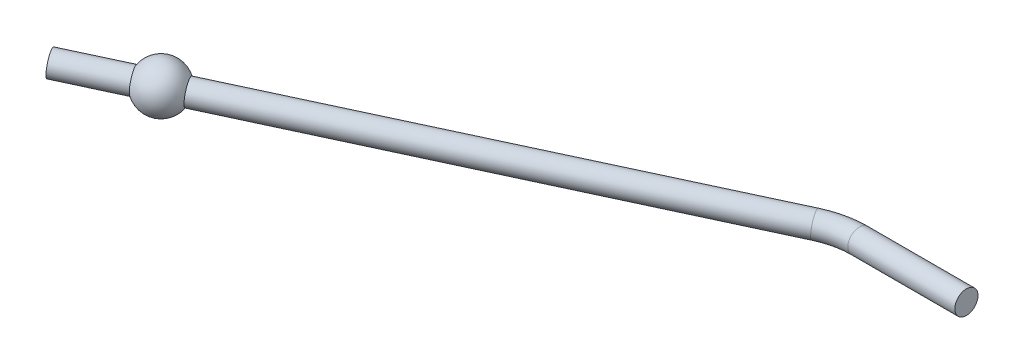
ISO-10303-21;
HEADER;
FILE_DESCRIPTION(('STEP AP214'),'2;1');
FILE_NAME('part.step','',(''),(''),'','','');
FILE_SCHEMA(('AUTOMOTIVE_DESIGN { 1 0 10303 214 1 1 1 1 }'));
ENDSEC;
DATA;
#1=APPLICATION_CONTEXT('core data for automotive mechanical design processes');
#2=APPLICATION_PROTOCOL_DEFINITION('international standard','automotive_design',2000,#1);
#3=PRODUCT_CONTEXT('',#1,'mechanical');
#4=PRODUCT('Part','Part','',(#3));
#5=PRODUCT_RELATED_PRODUCT_CATEGORY('part','',(#4));
#6=PRODUCT_DEFINITION_FORMATION('','',#4);
#7=PRODUCT_DEFINITION_CONTEXT('part definition',#1,'design');
#8=PRODUCT_DEFINITION('design','',#6,#7);
#9=PRODUCT_DEFINITION_SHAPE('','',#8);
#10=(LENGTH_UNIT() NAMED_UNIT(*) SI_UNIT(.MILLI.,.METRE.));
#11=(NAMED_UNIT(*) PLANE_ANGLE_UNIT() SI_UNIT($,.RADIAN.));
#12=(NAMED_UNIT(*) SI_UNIT($,.STERADIAN.) SOLID_ANGLE_UNIT());
#13=UNCERTAINTY_MEASURE_WITH_UNIT(LENGTH_MEASURE(1.E-05),#10,'distance_accuracy_value','');
#14=(GEOMETRIC_REPRESENTATION_CONTEXT(3) GLOBAL_UNCERTAINTY_ASSIGNED_CONTEXT((#13)) GLOBAL_UNIT_ASSIGNED_CONTEXT((#10,
#11,#12)) REPRESENTATION_CONTEXT('',''));
#15=CARTESIAN_POINT('',(0.,0.,0.));
#16=DIRECTION('',(0.,0.,1.));
#17=DIRECTION('',(1.,0.,0.));
#18=AXIS2_PLACEMENT_3D('',#15,#16,#17);
#19=CARTESIAN_POINT('',(-68.6428100890678,4.22365233231175,31.6927115761108));
#20=DIRECTION('',(0.86398913526091,-0.0665142099576653,-0.499097820096233));
#21=DIRECTION('',(-0.500205536319584,0.,-0.865906704810188));
#22=AXIS2_PLACEMENT_3D('',#19,#20,#21);
#23=CYLINDRICAL_SURFACE('',#22,1.27);
#24=CARTESIAN_POINT('',(-15.5578955589094,0.136909795234124,1.02732003273683));
#25=DIRECTION('',(0.863989135260911,-0.0665142099576653,-0.499097820096233));
#26=DIRECTION('',(-0.500205536319583,0.,-0.865906704810188));
#27=AXIS2_PLACEMENT_3D('',#24,#25,#26);
#28=CIRCLE('',#27,1.27);
#29=CARTESIAN_POINT('',(-16.1973538315342,-0.00804011473568033,-0.0603300218172294));
#30=VERTEX_POINT('',#29);
#31=EDGE_CURVE('E62',#30,#30,#28,.T.);
#32=ORIENTED_EDGE('',*,*,#31,.F.);
#33=EDGE_LOOP('',(#32));
#34=FACE_BOUND('',#33,.T.);
#35=CARTESIAN_POINT('',(-59.0614258656849,3.48602939712669,26.1578642218663));
#36=DIRECTION('',(-0.863989135260911,0.0665142099576653,0.499097820096233));
#37=DIRECTION('',(0.500205536319583,0.,0.865906704810188));
#38=AXIS2_PLACEMENT_3D('',#35,#36,#37);
#39=CIRCLE('',#38,1.27);
#40=CARTESIAN_POINT('',(-58.4261648345591,3.48602939712669,27.2575657369752));
#41=VERTEX_POINT('',#40);
#42=EDGE_CURVE('E37',#41,#41,#39,.F.);
#43=ORIENTED_EDGE('',*,*,#42,.T.);
#44=EDGE_LOOP('',(#43));
#45=FACE_BOUND('',#44,.T.);
#46=ADVANCED_FACE('F33',(#34,#45),#23,.T.);
#47=CARTESIAN_POINT('',(0.,0.,0.));
#48=DIRECTION('',(1.,0.,0.));
#49=DIRECTION('',(0.,-0.0178492328283288,-0.999840689753842));
#50=AXIS2_PLACEMENT_3D('',#47,#48,#49);
#51=PLANE('',#50);
#52=CARTESIAN_POINT('',(0.,0.,0.));
#53=DIRECTION('',(1.,0.,0.));
#54=DIRECTION('',(0.,-0.0178492328283288,-0.999840689753842));
#55=AXIS2_PLACEMENT_3D('',#52,#53,#54);
#56=CIRCLE('',#55,1.27);
#57=CARTESIAN_POINT('',(0.,-0.0226685256919767,-1.26979767598738));
#58=VERTEX_POINT('',#57);
#59=EDGE_CURVE('E11',#58,#58,#56,.T.);
#60=ORIENTED_EDGE('',*,*,#59,.T.);
#61=EDGE_LOOP('',(#60));
#62=FACE_BOUND('',#61,.T.);
#63=ADVANCED_FACE('F51',(#62),#51,.T.);
#64=CARTESIAN_POINT('',(-11.7211459231605,1.00660925505294,7.55322036006112));
#65=DIRECTION('',(0.,-0.991236267724556,0.132100952106686));
#66=DIRECTION('',(0.,-0.132100952106686,-0.991236267724556));
#67=AXIS2_PLACEMENT_3D('',#64,#65,#66);
#68=TOROIDAL_SURFACE('',#67,7.62000000000001,1.27);
#69=CARTESIAN_POINT('',(-11.7211459231605,0.,0.));
#70=DIRECTION('',(1.,0.,0.));
#71=DIRECTION('',(0.,-0.0178492328283289,-0.999840689753843));
#72=AXIS2_PLACEMENT_3D('',#69,#70,#71);
#73=CIRCLE('',#72,1.27);
#74=CARTESIAN_POINT('',(-11.7211459231605,-0.167768209175492,-1.2588700600102));
#75=VERTEX_POINT('',#74);
#76=EDGE_CURVE('E42',#75,#75,#73,.T.);
#77=CARTESIAN_POINT('',(-11.7211459231605,1.00660925505294,7.55322036006112));
#78=DIRECTION('',(0.,-0.991236267724556,0.132100952106686));
#79=DIRECTION('',(0.,-0.132100952106686,-0.991236267724556));
#80=AXIS2_PLACEMENT_3D('',#77,#78,#79);
#81=CIRCLE('',#80,8.89000000000001);
#82=EDGE_CURVE('',#30,#75,#81,.T.);
#83=ORIENTED_EDGE('',*,*,#31,.T.);
#84=ORIENTED_EDGE('',*,*,#76,.F.);
#85=ORIENTED_EDGE('',*,*,#82,.T.);
#86=ORIENTED_EDGE('',*,*,#82,.F.);
#87=EDGE_LOOP('',(#83,#85,#84,#86));
#88=FACE_BOUND('',#87,.T.);
#89=ADVANCED_FACE('F57',(#88),#68,.T.);
#90=CARTESIAN_POINT('',(-11.7211459231605,0.,0.));
#91=DIRECTION('',(1.,0.,0.));
#92=DIRECTION('',(0.,0.,-1.));
#93=AXIS2_PLACEMENT_3D('',#90,#91,#92);
#94=CYLINDRICAL_SURFACE('',#93,1.27);
#95=ORIENTED_EDGE('',*,*,#59,.F.);
#96=EDGE_LOOP('',(#95));
#97=FACE_BOUND('',#96,.T.);
#98=ORIENTED_EDGE('',*,*,#76,.T.);
#99=EDGE_LOOP('',(#98));
#100=FACE_BOUND('',#99,.T.);
#101=ADVANCED_FACE('F53',(#97,#100),#94,.T.);
#102=CARTESIAN_POINT('',(-60.9619466765984,3.63234100578811,27.2557319554553));
#103=DIRECTION('',(0.0767578832685192,0.997049761725129,0.));
#104=DIRECTION('',(-0.49762536260448,0.0383096922145191,-0.866545651408619));
#105=AXIS2_PLACEMENT_3D('',#102,#103,#104);
#106=SPHERICAL_SURFACE('',#105,2.54);
#107=CARTESIAN_POINT('',(-60.9619466765984,3.63234100578811,27.2557319554553));
#108=DIRECTION('',(-0.863989135260911,0.0665142099576653,0.499097820096232));
#109=DIRECTION('',(0.500205536319583,0.,0.865906704810188));
#110=AXIS2_PLACEMENT_3D('',#107,#108,#109);
#111=SPHERICAL_SURFACE('',#110,2.54);
#112=ORIENTED_EDGE('',*,*,#42,.F.);
#113=EDGE_LOOP('',(#112));
#114=FACE_BOUND('',#113,.T.);
#115=CARTESIAN_POINT('',(-62.8624674875118,3.77865261444952,28.3535996890443));
#116=DIRECTION('',(0.863989135260911,-0.0665142099576653,-0.499097820096233));
#117=DIRECTION('',(-0.500205536319583,0.,-0.865906704810188));
#118=AXIS2_PLACEMENT_3D('',#115,#116,#117);
#119=CIRCLE('',#118,1.27);
#120=CARTESIAN_POINT('',(-63.4977285186377,3.77865261444952,27.2538981739354));
#121=VERTEX_POINT('',#120);
#122=EDGE_CURVE('E67',#121,#121,#119,.F.);
#123=ORIENTED_EDGE('',*,*,#122,.F.);
#124=EDGE_LOOP('',(#123));
#125=FACE_BOUND('',#124,.T.);
#126=ADVANCED_FACE('F56',(#114,#125),#111,.T.);
#127=CARTESIAN_POINT('',(-68.6428100890678,4.22365233231175,31.6927115761108));
#128=DIRECTION('',(0.863989135260911,-0.0665142099576653,-0.499097820096233));
#129=DIRECTION('',(-0.500205536319583,0.,-0.865906704810188));
#130=AXIS2_PLACEMENT_3D('',#127,#128,#129);
#131=PLANE('',#130);
#132=CARTESIAN_POINT('',(-68.6428100890678,4.22365233231175,31.6927115761108));
#133=DIRECTION('',(0.863989135260911,-0.0665142099576653,-0.499097820096233));
#134=DIRECTION('',(-0.500205536319583,0.,-0.865906704810188));
#135=AXIS2_PLACEMENT_3D('',#132,#133,#134);
#136=CIRCLE('',#135,1.27);
#137=CARTESIAN_POINT('',(-69.2780711201937,4.22365233231175,30.5930100610019));
#138=VERTEX_POINT('',#137);
#139=EDGE_CURVE('E48',#138,#138,#136,.T.);
#140=ORIENTED_EDGE('',*,*,#139,.F.);
#141=EDGE_LOOP('',(#140));
#142=FACE_BOUND('',#141,.T.);
#143=ADVANCED_FACE('F35',(#142),#131,.F.);
#144=ORIENTED_EDGE('',*,*,#139,.T.);
#145=EDGE_LOOP('',(#144));
#146=FACE_BOUND('',#145,.T.);
#147=ORIENTED_EDGE('',*,*,#122,.T.);
#148=EDGE_LOOP('',(#147));
#149=FACE_BOUND('',#148,.T.);
#150=ADVANCED_FACE('F75',(#146,#149),#23,.T.);
#151=CLOSED_SHELL('',(#46,#63,#89,#101,#126,#143,#150));
#152=MANIFOLD_SOLID_BREP('B2',#151);
#153=ADVANCED_BREP_SHAPE_REPRESENTATION('',(#18,#152),#14);
#154=SHAPE_DEFINITION_REPRESENTATION(#9,#153);
ENDSEC;
END-ISO-10303-21;
